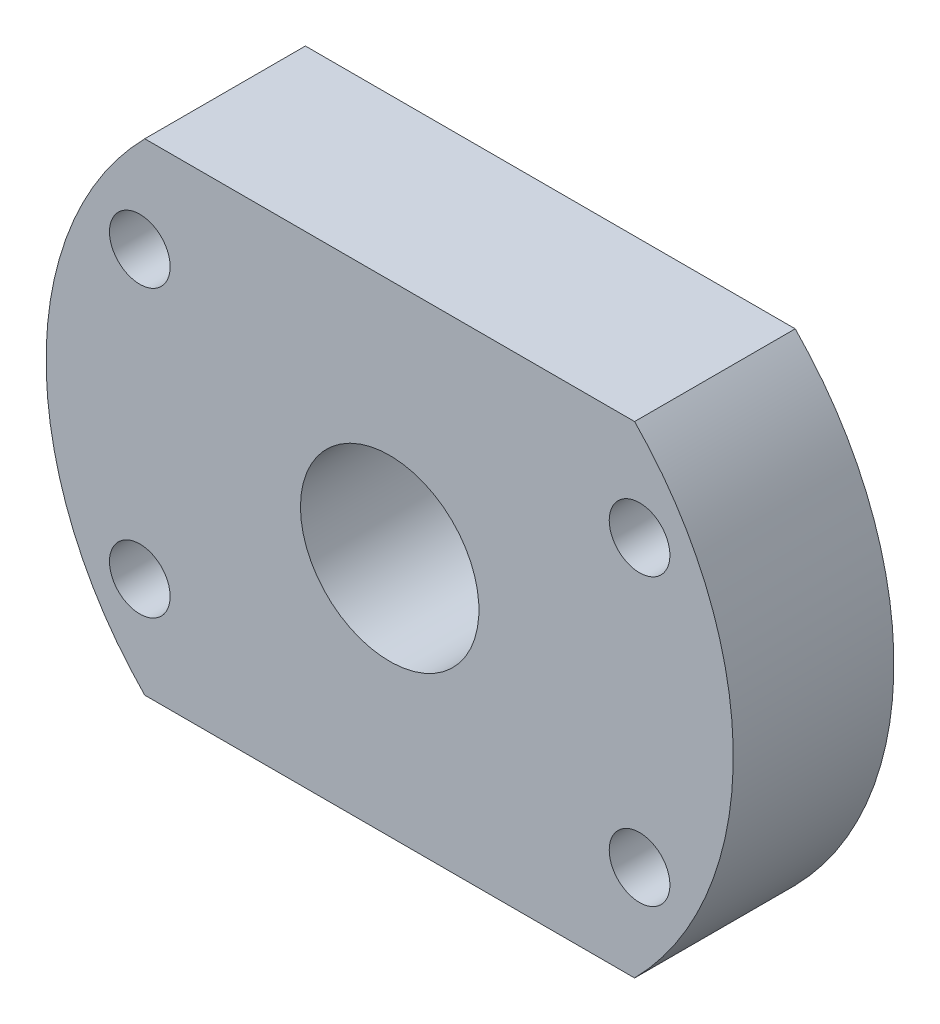
ISO-10303-21;
HEADER;
FILE_DESCRIPTION(('STEP AP214'),'2;1');
FILE_NAME('part.step','',(''),(''),'','','');
FILE_SCHEMA(('AUTOMOTIVE_DESIGN { 1 0 10303 214 1 1 1 1 }'));
ENDSEC;
DATA;
#1=APPLICATION_CONTEXT('core data for automotive mechanical design processes');
#2=APPLICATION_PROTOCOL_DEFINITION('international standard','automotive_design',2000,#1);
#3=PRODUCT_CONTEXT('',#1,'mechanical');
#4=PRODUCT('Part','Part','',(#3));
#5=PRODUCT_RELATED_PRODUCT_CATEGORY('part','',(#4));
#6=PRODUCT_DEFINITION_FORMATION('','',#4);
#7=PRODUCT_DEFINITION_CONTEXT('part definition',#1,'design');
#8=PRODUCT_DEFINITION('design','',#6,#7);
#9=PRODUCT_DEFINITION_SHAPE('','',#8);
#10=(LENGTH_UNIT() NAMED_UNIT(*) SI_UNIT(.MILLI.,.METRE.));
#11=(NAMED_UNIT(*) PLANE_ANGLE_UNIT() SI_UNIT($,.RADIAN.));
#12=(NAMED_UNIT(*) SI_UNIT($,.STERADIAN.) SOLID_ANGLE_UNIT());
#13=UNCERTAINTY_MEASURE_WITH_UNIT(LENGTH_MEASURE(1.E-05),#10,'distance_accuracy_value','');
#14=(GEOMETRIC_REPRESENTATION_CONTEXT(3) GLOBAL_UNCERTAINTY_ASSIGNED_CONTEXT((#13)) GLOBAL_UNIT_ASSIGNED_CONTEXT((#10,
#11,#12)) REPRESENTATION_CONTEXT('',''));
#15=CARTESIAN_POINT('',(0.,0.,0.));
#16=DIRECTION('',(0.,0.,1.));
#17=DIRECTION('',(1.,0.,0.));
#18=AXIS2_PLACEMENT_3D('',#15,#16,#17);
#19=CARTESIAN_POINT('',(448.510652388512,-417.151572168843,-583.35));
#20=DIRECTION('',(0.,0.,-1.));
#21=DIRECTION('',(-1.,0.,0.));
#22=AXIS2_PLACEMENT_3D('',#19,#20,#21);
#23=CYLINDRICAL_SURFACE('',#22,5.5);
#24=CARTESIAN_POINT('',(448.510652388512,-417.151572168843,-583.35));
#25=DIRECTION('',(0.,0.,-1.));
#26=DIRECTION('',(-1.,0.,0.));
#27=AXIS2_PLACEMENT_3D('',#24,#25,#26);
#28=CIRCLE('',#27,5.5);
#29=CARTESIAN_POINT('',(443.010652388512,-417.151572168843,-583.35));
#30=VERTEX_POINT('',#29);
#31=EDGE_CURVE('E149',#30,#30,#28,.F.);
#32=ORIENTED_EDGE('',*,*,#31,.F.);
#33=EDGE_LOOP('',(#32));
#34=FACE_BOUND('',#33,.T.);
#35=CARTESIAN_POINT('',(448.510652388512,-417.151572168843,-576.85));
#36=DIRECTION('',(0.,0.,-1.));
#37=DIRECTION('',(-1.,0.,0.));
#38=AXIS2_PLACEMENT_3D('',#35,#36,#37);
#39=CIRCLE('',#38,5.5);
#40=CARTESIAN_POINT('',(443.010652388512,-417.151572168843,-576.85));
#41=VERTEX_POINT('',#40);
#42=EDGE_CURVE('E152',#41,#41,#39,.T.);
#43=ORIENTED_EDGE('',*,*,#42,.F.);
#44=EDGE_LOOP('',(#43));
#45=FACE_BOUND('',#44,.T.);
#46=ADVANCED_FACE('F17',(#34,#45),#23,.F.);
#47=CARTESIAN_POINT('',(504.510652388512,-417.151572168843,-583.35));
#48=DIRECTION('',(0.,0.,-1.));
#49=DIRECTION('',(-1.,0.,0.));
#50=AXIS2_PLACEMENT_3D('',#47,#48,#49);
#51=CYLINDRICAL_SURFACE('',#50,5.5);
#52=CARTESIAN_POINT('',(504.510652388512,-417.151572168843,-583.35));
#53=DIRECTION('',(0.,0.,-1.));
#54=DIRECTION('',(-1.,0.,0.));
#55=AXIS2_PLACEMENT_3D('',#52,#53,#54);
#56=CIRCLE('',#55,5.5);
#57=CARTESIAN_POINT('',(499.010652388512,-417.151572168843,-583.35));
#58=VERTEX_POINT('',#57);
#59=EDGE_CURVE('E145',#58,#58,#56,.F.);
#60=ORIENTED_EDGE('',*,*,#59,.F.);
#61=EDGE_LOOP('',(#60));
#62=FACE_BOUND('',#61,.T.);
#63=CARTESIAN_POINT('',(504.510652388512,-417.151572168843,-576.85));
#64=DIRECTION('',(0.,0.,-1.));
#65=DIRECTION('',(-1.,0.,0.));
#66=AXIS2_PLACEMENT_3D('',#63,#64,#65);
#67=CIRCLE('',#66,5.5);
#68=CARTESIAN_POINT('',(499.010652388512,-417.151572168843,-576.85));
#69=VERTEX_POINT('',#68);
#70=EDGE_CURVE('E20',#69,#69,#67,.T.);
#71=ORIENTED_EDGE('',*,*,#70,.F.);
#72=EDGE_LOOP('',(#71));
#73=FACE_BOUND('',#72,.T.);
#74=ADVANCED_FACE('F173',(#62,#73),#51,.F.);
#75=CARTESIAN_POINT('',(504.510652388512,-385.151572168843,-583.35));
#76=DIRECTION('',(0.,0.,-1.));
#77=DIRECTION('',(-1.,0.,0.));
#78=AXIS2_PLACEMENT_3D('',#75,#76,#77);
#79=CYLINDRICAL_SURFACE('',#78,5.5);
#80=CARTESIAN_POINT('',(504.510652388512,-385.151572168843,-583.35));
#81=DIRECTION('',(0.,0.,-1.));
#82=DIRECTION('',(-1.,0.,0.));
#83=AXIS2_PLACEMENT_3D('',#80,#81,#82);
#84=CIRCLE('',#83,5.5);
#85=CARTESIAN_POINT('',(499.010652388512,-385.151572168843,-583.35));
#86=VERTEX_POINT('',#85);
#87=EDGE_CURVE('E141',#86,#86,#84,.F.);
#88=ORIENTED_EDGE('',*,*,#87,.F.);
#89=EDGE_LOOP('',(#88));
#90=FACE_BOUND('',#89,.T.);
#91=CARTESIAN_POINT('',(504.510652388512,-385.151572168843,-576.85));
#92=DIRECTION('',(0.,0.,-1.));
#93=DIRECTION('',(-1.,0.,0.));
#94=AXIS2_PLACEMENT_3D('',#91,#92,#93);
#95=CIRCLE('',#94,5.5);
#96=CARTESIAN_POINT('',(499.010652388512,-385.151572168843,-576.85));
#97=VERTEX_POINT('',#96);
#98=EDGE_CURVE('E159',#97,#97,#95,.T.);
#99=ORIENTED_EDGE('',*,*,#98,.F.);
#100=EDGE_LOOP('',(#99));
#101=FACE_BOUND('',#100,.T.);
#102=ADVANCED_FACE('F175',(#90,#101),#79,.F.);
#103=CARTESIAN_POINT('',(448.510652388512,-385.151572168843,-583.35));
#104=DIRECTION('',(0.,0.,-1.));
#105=DIRECTION('',(-1.,0.,0.));
#106=AXIS2_PLACEMENT_3D('',#103,#104,#105);
#107=CYLINDRICAL_SURFACE('',#106,5.5);
#108=CARTESIAN_POINT('',(448.510652388512,-385.151572168843,-583.35));
#109=DIRECTION('',(0.,0.,-1.));
#110=DIRECTION('',(-1.,0.,0.));
#111=AXIS2_PLACEMENT_3D('',#108,#109,#110);
#112=CIRCLE('',#111,5.5);
#113=CARTESIAN_POINT('',(443.010652388512,-385.151572168843,-583.35));
#114=VERTEX_POINT('',#113);
#115=EDGE_CURVE('E137',#114,#114,#112,.F.);
#116=ORIENTED_EDGE('',*,*,#115,.F.);
#117=EDGE_LOOP('',(#116));
#118=FACE_BOUND('',#117,.T.);
#119=CARTESIAN_POINT('',(448.510652388512,-385.151572168843,-576.85));
#120=DIRECTION('',(0.,0.,-1.));
#121=DIRECTION('',(-1.,0.,0.));
#122=AXIS2_PLACEMENT_3D('',#119,#120,#121);
#123=CIRCLE('',#122,5.5);
#124=CARTESIAN_POINT('',(443.010652388512,-385.151572168843,-576.85));
#125=VERTEX_POINT('',#124);
#126=EDGE_CURVE('E156',#125,#125,#123,.T.);
#127=ORIENTED_EDGE('',*,*,#126,.F.);
#128=EDGE_LOOP('',(#127));
#129=FACE_BOUND('',#128,.T.);
#130=ADVANCED_FACE('F181',(#118,#129),#107,.F.);
#131=CARTESIAN_POINT('',(401.510652388512,-401.151572168843,-576.85));
#132=DIRECTION('',(0.,0.,-1.));
#133=DIRECTION('',(-1.,0.,0.));
#134=AXIS2_PLACEMENT_3D('',#131,#132,#133);
#135=PLANE('',#134);
#136=ORIENTED_EDGE('',*,*,#70,.T.);
#137=EDGE_LOOP('',(#136));
#138=FACE_BOUND('',#137,.T.);
#139=CARTESIAN_POINT('',(504.510652388512,-417.151572168843,-576.85));
#140=DIRECTION('',(0.,0.,-1.));
#141=DIRECTION('',(-1.,0.,0.));
#142=AXIS2_PLACEMENT_3D('',#139,#140,#141);
#143=CIRCLE('',#142,3.4);
#144=CARTESIAN_POINT('',(501.110652388512,-417.151572168843,-576.85));
#145=VERTEX_POINT('',#144);
#146=EDGE_CURVE('E129',#145,#145,#143,.F.);
#147=ORIENTED_EDGE('',*,*,#146,.T.);
#148=EDGE_LOOP('',(#147));
#149=FACE_BOUND('',#148,.T.);
#150=ADVANCED_FACE('F170',(#138,#149),#135,.T.);
#151=CARTESIAN_POINT('',(401.510652388512,-401.151572168843,-576.85));
#152=DIRECTION('',(0.,0.,-1.));
#153=DIRECTION('',(-1.,0.,0.));
#154=AXIS2_PLACEMENT_3D('',#151,#152,#153);
#155=PLANE('',#154);
#156=ORIENTED_EDGE('',*,*,#98,.T.);
#157=EDGE_LOOP('',(#156));
#158=FACE_BOUND('',#157,.T.);
#159=CARTESIAN_POINT('',(504.510652388512,-385.151572168843,-576.85));
#160=DIRECTION('',(0.,0.,-1.));
#161=DIRECTION('',(-1.,0.,0.));
#162=AXIS2_PLACEMENT_3D('',#159,#160,#161);
#163=CIRCLE('',#162,3.4);
#164=CARTESIAN_POINT('',(501.110652388512,-385.151572168843,-576.85));
#165=VERTEX_POINT('',#164);
#166=EDGE_CURVE('E125',#165,#165,#163,.F.);
#167=ORIENTED_EDGE('',*,*,#166,.T.);
#168=EDGE_LOOP('',(#167));
#169=FACE_BOUND('',#168,.T.);
#170=ADVANCED_FACE('F234',(#158,#169),#155,.T.);
#171=CARTESIAN_POINT('',(401.510652388512,-401.151572168843,-576.85));
#172=DIRECTION('',(0.,0.,-1.));
#173=DIRECTION('',(-1.,0.,0.));
#174=AXIS2_PLACEMENT_3D('',#171,#172,#173);
#175=PLANE('',#174);
#176=ORIENTED_EDGE('',*,*,#126,.T.);
#177=EDGE_LOOP('',(#176));
#178=FACE_BOUND('',#177,.T.);
#179=CARTESIAN_POINT('',(448.510652388512,-385.151572168843,-576.85));
#180=DIRECTION('',(0.,0.,-1.));
#181=DIRECTION('',(-1.,0.,0.));
#182=AXIS2_PLACEMENT_3D('',#179,#180,#181);
#183=CIRCLE('',#182,3.4);
#184=CARTESIAN_POINT('',(445.110652388512,-385.151572168843,-576.85));
#185=VERTEX_POINT('',#184);
#186=EDGE_CURVE('E121',#185,#185,#183,.F.);
#187=ORIENTED_EDGE('',*,*,#186,.T.);
#188=EDGE_LOOP('',(#187));
#189=FACE_BOUND('',#188,.T.);
#190=ADVANCED_FACE('F230',(#178,#189),#175,.T.);
#191=CARTESIAN_POINT('',(401.510652388512,-401.151572168843,-576.85));
#192=DIRECTION('',(0.,0.,-1.));
#193=DIRECTION('',(-1.,0.,0.));
#194=AXIS2_PLACEMENT_3D('',#191,#192,#193);
#195=PLANE('',#194);
#196=ORIENTED_EDGE('',*,*,#42,.T.);
#197=EDGE_LOOP('',(#196));
#198=FACE_BOUND('',#197,.T.);
#199=CARTESIAN_POINT('',(448.510652388512,-417.151572168843,-576.85));
#200=DIRECTION('',(0.,0.,-1.));
#201=DIRECTION('',(-1.,0.,0.));
#202=AXIS2_PLACEMENT_3D('',#199,#200,#201);
#203=CIRCLE('',#202,3.4);
#204=CARTESIAN_POINT('',(445.110652388512,-417.151572168843,-576.85));
#205=VERTEX_POINT('',#204);
#206=EDGE_CURVE('E78',#205,#205,#203,.F.);
#207=ORIENTED_EDGE('',*,*,#206,.T.);
#208=EDGE_LOOP('',(#207));
#209=FACE_BOUND('',#208,.T.);
#210=ADVANCED_FACE('F226',(#198,#209),#195,.T.);
#211=CARTESIAN_POINT('',(401.510652388512,-401.151572168843,-583.35));
#212=DIRECTION('',(0.,0.,-1.));
#213=DIRECTION('',(-1.,0.,0.));
#214=AXIS2_PLACEMENT_3D('',#211,#212,#213);
#215=PLANE('',#214);
#216=ORIENTED_EDGE('',*,*,#115,.T.);
#217=EDGE_LOOP('',(#216));
#218=FACE_BOUND('',#217,.T.);
#219=ORIENTED_EDGE('',*,*,#87,.T.);
#220=EDGE_LOOP('',(#219));
#221=FACE_BOUND('',#220,.T.);
#222=ORIENTED_EDGE('',*,*,#59,.T.);
#223=EDGE_LOOP('',(#222));
#224=FACE_BOUND('',#223,.T.);
#225=CARTESIAN_POINT('',(476.510652388512,-401.151572168843,-583.35));
#226=DIRECTION('',(0.,0.,-1.));
#227=DIRECTION('',(-1.,0.,0.));
#228=AXIS2_PLACEMENT_3D('',#225,#226,#227);
#229=CIRCLE('',#228,10.);
#230=CARTESIAN_POINT('',(466.510652388512,-401.151572168843,-583.35));
#231=VERTEX_POINT('',#230);
#232=EDGE_CURVE('E133',#231,#231,#229,.F.);
#233=ORIENTED_EDGE('',*,*,#232,.T.);
#234=EDGE_LOOP('',(#233));
#235=FACE_BOUND('',#234,.T.);
#236=ORIENTED_EDGE('',*,*,#31,.T.);
#237=EDGE_LOOP('',(#236));
#238=FACE_BOUND('',#237,.T.);
#239=DIRECTION('',(1.,0.,0.));
#240=VECTOR('',#239,1.);
#241=CARTESIAN_POINT('',(449.065252045285,-428.151572168843,-583.35));
#242=LINE('',#241,#240);
#243=CARTESIAN_POINT('',(449.065252045285,-428.151572168843,-583.35));
#244=VERTEX_POINT('',#243);
#245=CARTESIAN_POINT('',(503.956052731739,-428.151572168843,-583.35));
#246=VERTEX_POINT('',#245);
#247=EDGE_CURVE('E54',#244,#246,#242,.T.);
#248=ORIENTED_EDGE('',*,*,#247,.F.);
#249=CARTESIAN_POINT('',(476.510652388512,-401.151572168843,-583.35));
#250=DIRECTION('',(0.,0.,-1.));
#251=DIRECTION('',(-1.,0.,0.));
#252=AXIS2_PLACEMENT_3D('',#249,#250,#251);
#253=CIRCLE('',#252,38.5);
#254=CARTESIAN_POINT('',(449.065252045285,-374.151572168843,-583.35));
#255=VERTEX_POINT('',#254);
#256=EDGE_CURVE('E73',#255,#244,#253,.F.);
#257=ORIENTED_EDGE('',*,*,#256,.F.);
#258=DIRECTION('',(-1.,0.,0.));
#259=VECTOR('',#258,1.);
#260=CARTESIAN_POINT('',(503.956052731738,-374.151572168843,-583.35));
#261=LINE('',#260,#259);
#262=CARTESIAN_POINT('',(503.956052731739,-374.151572168843,-583.35));
#263=VERTEX_POINT('',#262);
#264=EDGE_CURVE('E69',#263,#255,#261,.T.);
#265=ORIENTED_EDGE('',*,*,#264,.F.);
#266=CARTESIAN_POINT('',(476.510652388512,-401.151572168843,-583.35));
#267=DIRECTION('',(0.,0.,-1.));
#268=DIRECTION('',(-1.,0.,0.));
#269=AXIS2_PLACEMENT_3D('',#266,#267,#268);
#270=CIRCLE('',#269,38.5);
#271=EDGE_CURVE('E59',#246,#263,#270,.F.);
#272=ORIENTED_EDGE('',*,*,#271,.F.);
#273=EDGE_LOOP('',(#248,#257,#265,#272));
#274=FACE_BOUND('',#273,.T.);
#275=ADVANCED_FACE('F72',(#218,#221,#224,#235,#238,#274),#215,.T.);
#276=CARTESIAN_POINT('',(476.510652388512,-401.151572168843,-565.35));
#277=DIRECTION('',(0.,0.,-1.));
#278=DIRECTION('',(-1.,0.,0.));
#279=AXIS2_PLACEMENT_3D('',#276,#277,#278);
#280=CYLINDRICAL_SURFACE('',#279,10.);
#281=CARTESIAN_POINT('',(476.510652388512,-401.151572168843,-565.35));
#282=DIRECTION('',(0.,0.,-1.));
#283=DIRECTION('',(-1.,0.,0.));
#284=AXIS2_PLACEMENT_3D('',#281,#282,#283);
#285=CIRCLE('',#284,10.);
#286=CARTESIAN_POINT('',(466.510652388512,-401.151572168843,-565.35));
#287=VERTEX_POINT('',#286);
#288=EDGE_CURVE('E111',#287,#287,#285,.F.);
#289=ORIENTED_EDGE('',*,*,#288,.T.);
#290=EDGE_LOOP('',(#289));
#291=FACE_BOUND('',#290,.T.);
#292=ORIENTED_EDGE('',*,*,#232,.F.);
#293=EDGE_LOOP('',(#292));
#294=FACE_BOUND('',#293,.T.);
#295=ADVANCED_FACE('F219',(#291,#294),#280,.F.);
#296=CARTESIAN_POINT('',(504.510652388512,-417.151572168843,-565.35));
#297=DIRECTION('',(0.,0.,-1.));
#298=DIRECTION('',(-1.,0.,0.));
#299=AXIS2_PLACEMENT_3D('',#296,#297,#298);
#300=CYLINDRICAL_SURFACE('',#299,3.4);
#301=CARTESIAN_POINT('',(504.510652388512,-417.151572168843,-565.35));
#302=DIRECTION('',(0.,0.,-1.));
#303=DIRECTION('',(-1.,0.,0.));
#304=AXIS2_PLACEMENT_3D('',#301,#302,#303);
#305=CIRCLE('',#304,3.4);
#306=CARTESIAN_POINT('',(501.110652388512,-417.151572168843,-565.35));
#307=VERTEX_POINT('',#306);
#308=EDGE_CURVE('E107',#307,#307,#305,.F.);
#309=ORIENTED_EDGE('',*,*,#308,.T.);
#310=EDGE_LOOP('',(#309));
#311=FACE_BOUND('',#310,.T.);
#312=ORIENTED_EDGE('',*,*,#146,.F.);
#313=EDGE_LOOP('',(#312));
#314=FACE_BOUND('',#313,.T.);
#315=ADVANCED_FACE('F215',(#311,#314),#300,.F.);
#316=CARTESIAN_POINT('',(504.510652388512,-385.151572168843,-565.35));
#317=DIRECTION('',(0.,0.,-1.));
#318=DIRECTION('',(-1.,0.,0.));
#319=AXIS2_PLACEMENT_3D('',#316,#317,#318);
#320=CYLINDRICAL_SURFACE('',#319,3.4);
#321=CARTESIAN_POINT('',(504.510652388512,-385.151572168843,-565.35));
#322=DIRECTION('',(0.,0.,-1.));
#323=DIRECTION('',(-1.,0.,0.));
#324=AXIS2_PLACEMENT_3D('',#321,#322,#323);
#325=CIRCLE('',#324,3.4);
#326=CARTESIAN_POINT('',(501.110652388512,-385.151572168843,-565.35));
#327=VERTEX_POINT('',#326);
#328=EDGE_CURVE('E103',#327,#327,#325,.F.);
#329=ORIENTED_EDGE('',*,*,#328,.T.);
#330=EDGE_LOOP('',(#329));
#331=FACE_BOUND('',#330,.T.);
#332=ORIENTED_EDGE('',*,*,#166,.F.);
#333=EDGE_LOOP('',(#332));
#334=FACE_BOUND('',#333,.T.);
#335=ADVANCED_FACE('F211',(#331,#334),#320,.F.);
#336=CARTESIAN_POINT('',(448.510652388512,-385.151572168843,-565.35));
#337=DIRECTION('',(0.,0.,-1.));
#338=DIRECTION('',(-1.,0.,0.));
#339=AXIS2_PLACEMENT_3D('',#336,#337,#338);
#340=CYLINDRICAL_SURFACE('',#339,3.4);
#341=CARTESIAN_POINT('',(448.510652388512,-385.151572168843,-565.35));
#342=DIRECTION('',(0.,0.,-1.));
#343=DIRECTION('',(-1.,0.,0.));
#344=AXIS2_PLACEMENT_3D('',#341,#342,#343);
#345=CIRCLE('',#344,3.4);
#346=CARTESIAN_POINT('',(445.110652388512,-385.151572168843,-565.35));
#347=VERTEX_POINT('',#346);
#348=EDGE_CURVE('E99',#347,#347,#345,.F.);
#349=ORIENTED_EDGE('',*,*,#348,.T.);
#350=EDGE_LOOP('',(#349));
#351=FACE_BOUND('',#350,.T.);
#352=ORIENTED_EDGE('',*,*,#186,.F.);
#353=EDGE_LOOP('',(#352));
#354=FACE_BOUND('',#353,.T.);
#355=ADVANCED_FACE('F207',(#351,#354),#340,.F.);
#356=CARTESIAN_POINT('',(448.510652388512,-417.151572168843,-565.35));
#357=DIRECTION('',(0.,0.,-1.));
#358=DIRECTION('',(-1.,0.,0.));
#359=AXIS2_PLACEMENT_3D('',#356,#357,#358);
#360=CYLINDRICAL_SURFACE('',#359,3.4);
#361=CARTESIAN_POINT('',(448.510652388512,-417.151572168843,-565.35));
#362=DIRECTION('',(0.,0.,-1.));
#363=DIRECTION('',(-1.,0.,0.));
#364=AXIS2_PLACEMENT_3D('',#361,#362,#363);
#365=CIRCLE('',#364,3.4);
#366=CARTESIAN_POINT('',(445.110652388512,-417.151572168843,-565.35));
#367=VERTEX_POINT('',#366);
#368=EDGE_CURVE('E95',#367,#367,#365,.F.);
#369=ORIENTED_EDGE('',*,*,#368,.T.);
#370=EDGE_LOOP('',(#369));
#371=FACE_BOUND('',#370,.T.);
#372=ORIENTED_EDGE('',*,*,#206,.F.);
#373=EDGE_LOOP('',(#372));
#374=FACE_BOUND('',#373,.T.);
#375=ADVANCED_FACE('F204',(#371,#374),#360,.F.);
#376=CARTESIAN_POINT('',(503.956052731738,-374.151572168843,-565.35));
#377=DIRECTION('',(0.,1.,0.));
#378=DIRECTION('',(-1.,0.,0.));
#379=AXIS2_PLACEMENT_3D('',#376,#377,#378);
#380=PLANE('',#379);
#381=ORIENTED_EDGE('',*,*,#264,.T.);
#382=DIRECTION('',(0.,0.,-1.));
#383=VECTOR('',#382,1.);
#384=CARTESIAN_POINT('',(449.065252045285,-374.151572168843,-565.35));
#385=LINE('',#384,#383);
#386=CARTESIAN_POINT('',(449.065252045285,-374.151572168843,-565.35));
#387=VERTEX_POINT('',#386);
#388=EDGE_CURVE('E116',#387,#255,#385,.T.);
#389=ORIENTED_EDGE('',*,*,#388,.F.);
#390=DIRECTION('',(-1.,0.,0.));
#391=VECTOR('',#390,1.);
#392=CARTESIAN_POINT('',(401.510652388512,-374.151572168843,-565.35));
#393=LINE('',#392,#391);
#394=CARTESIAN_POINT('',(503.956052731739,-374.151572168843,-565.35));
#395=VERTEX_POINT('',#394);
#396=EDGE_CURVE('E82',#387,#395,#393,.F.);
#397=ORIENTED_EDGE('',*,*,#396,.T.);
#398=DIRECTION('',(0.,0.,-1.));
#399=VECTOR('',#398,1.);
#400=CARTESIAN_POINT('',(503.956052731739,-374.151572168843,-565.35));
#401=LINE('',#400,#399);
#402=EDGE_CURVE('E64',#263,#395,#401,.F.);
#403=ORIENTED_EDGE('',*,*,#402,.F.);
#404=EDGE_LOOP('',(#381,#389,#397,#403));
#405=FACE_BOUND('',#404,.T.);
#406=ADVANCED_FACE('F81',(#405),#380,.T.);
#407=CARTESIAN_POINT('',(476.510652388512,-401.151572168843,-565.35));
#408=DIRECTION('',(0.,0.,-1.));
#409=DIRECTION('',(-1.,0.,0.));
#410=AXIS2_PLACEMENT_3D('',#407,#408,#409);
#411=CYLINDRICAL_SURFACE('',#410,38.5);
#412=ORIENTED_EDGE('',*,*,#271,.T.);
#413=ORIENTED_EDGE('',*,*,#402,.T.);
#414=CARTESIAN_POINT('',(476.510652388512,-401.151572168843,-565.35));
#415=DIRECTION('',(0.,0.,-1.));
#416=DIRECTION('',(-1.,0.,0.));
#417=AXIS2_PLACEMENT_3D('',#414,#415,#416);
#418=CIRCLE('',#417,38.5);
#419=CARTESIAN_POINT('',(503.956052731739,-428.151572168843,-565.35));
#420=VERTEX_POINT('',#419);
#421=EDGE_CURVE('E92',#395,#420,#418,.T.);
#422=ORIENTED_EDGE('',*,*,#421,.T.);
#423=DIRECTION('',(0.,0.,1.));
#424=VECTOR('',#423,1.);
#425=CARTESIAN_POINT('',(503.956052731738,-428.151572168843,-565.35));
#426=LINE('',#425,#424);
#427=EDGE_CURVE('E66',#246,#420,#426,.T.);
#428=ORIENTED_EDGE('',*,*,#427,.F.);
#429=EDGE_LOOP('',(#412,#413,#422,#428));
#430=FACE_BOUND('',#429,.T.);
#431=ADVANCED_FACE('F61',(#430),#411,.T.);
#432=CARTESIAN_POINT('',(449.065252045285,-428.151572168843,-565.35));
#433=DIRECTION('',(0.,-1.,0.));
#434=DIRECTION('',(1.,0.,0.));
#435=AXIS2_PLACEMENT_3D('',#432,#433,#434);
#436=PLANE('',#435);
#437=ORIENTED_EDGE('',*,*,#247,.T.);
#438=ORIENTED_EDGE('',*,*,#427,.T.);
#439=DIRECTION('',(-1.,0.,0.));
#440=VECTOR('',#439,1.);
#441=CARTESIAN_POINT('',(401.510652388512,-428.151572168843,-565.35));
#442=LINE('',#441,#440);
#443=CARTESIAN_POINT('',(449.065252045285,-428.151572168843,-565.35));
#444=VERTEX_POINT('',#443);
#445=EDGE_CURVE('E27',#420,#444,#442,.T.);
#446=ORIENTED_EDGE('',*,*,#445,.T.);
#447=DIRECTION('',(0.,0.,-1.));
#448=VECTOR('',#447,1.);
#449=CARTESIAN_POINT('',(449.065252045285,-428.151572168843,-565.35));
#450=LINE('',#449,#448);
#451=EDGE_CURVE('E35',#244,#444,#450,.F.);
#452=ORIENTED_EDGE('',*,*,#451,.F.);
#453=EDGE_LOOP('',(#437,#438,#446,#452));
#454=FACE_BOUND('',#453,.T.);
#455=ADVANCED_FACE('F193',(#454),#436,.T.);
#456=CARTESIAN_POINT('',(476.510652388512,-401.151572168843,-565.35));
#457=DIRECTION('',(0.,0.,-1.));
#458=DIRECTION('',(-1.,0.,0.));
#459=AXIS2_PLACEMENT_3D('',#456,#457,#458);
#460=CYLINDRICAL_SURFACE('',#459,38.5);
#461=ORIENTED_EDGE('',*,*,#256,.T.);
#462=ORIENTED_EDGE('',*,*,#451,.T.);
#463=CARTESIAN_POINT('',(476.510652388512,-401.151572168843,-565.35));
#464=DIRECTION('',(0.,0.,-1.));
#465=DIRECTION('',(-1.,0.,0.));
#466=AXIS2_PLACEMENT_3D('',#463,#464,#465);
#467=CIRCLE('',#466,38.5);
#468=EDGE_CURVE('E11',#444,#387,#467,.T.);
#469=ORIENTED_EDGE('',*,*,#468,.T.);
#470=ORIENTED_EDGE('',*,*,#388,.T.);
#471=EDGE_LOOP('',(#461,#462,#469,#470));
#472=FACE_BOUND('',#471,.T.);
#473=ADVANCED_FACE('F188',(#472),#460,.T.);
#474=CARTESIAN_POINT('',(401.510652388512,-401.151572168843,-565.35));
#475=DIRECTION('',(0.,0.,-1.));
#476=DIRECTION('',(-1.,0.,0.));
#477=AXIS2_PLACEMENT_3D('',#474,#475,#476);
#478=PLANE('',#477);
#479=ORIENTED_EDGE('',*,*,#445,.F.);
#480=ORIENTED_EDGE('',*,*,#421,.F.);
#481=ORIENTED_EDGE('',*,*,#396,.F.);
#482=ORIENTED_EDGE('',*,*,#468,.F.);
#483=EDGE_LOOP('',(#479,#480,#481,#482));
#484=FACE_BOUND('',#483,.T.);
#485=ORIENTED_EDGE('',*,*,#368,.F.);
#486=EDGE_LOOP('',(#485));
#487=FACE_BOUND('',#486,.T.);
#488=ORIENTED_EDGE('',*,*,#348,.F.);
#489=EDGE_LOOP('',(#488));
#490=FACE_BOUND('',#489,.T.);
#491=ORIENTED_EDGE('',*,*,#328,.F.);
#492=EDGE_LOOP('',(#491));
#493=FACE_BOUND('',#492,.T.);
#494=ORIENTED_EDGE('',*,*,#308,.F.);
#495=EDGE_LOOP('',(#494));
#496=FACE_BOUND('',#495,.T.);
#497=ORIENTED_EDGE('',*,*,#288,.F.);
#498=EDGE_LOOP('',(#497));
#499=FACE_BOUND('',#498,.T.);
#500=ADVANCED_FACE('F186',(#484,#487,#490,#493,#496,#499),#478,.F.);
#501=CLOSED_SHELL('',(#46,#74,#102,#130,#150,#170,#190,#210,#275,#295,#315,#335,#355,#375,#406,
#431,#455,#473,#500));
#502=MANIFOLD_SOLID_BREP('B1',#501);
#503=ADVANCED_BREP_SHAPE_REPRESENTATION('',(#18,#502),#14);
#504=SHAPE_DEFINITION_REPRESENTATION(#9,#503);
ENDSEC;
END-ISO-10303-21;
